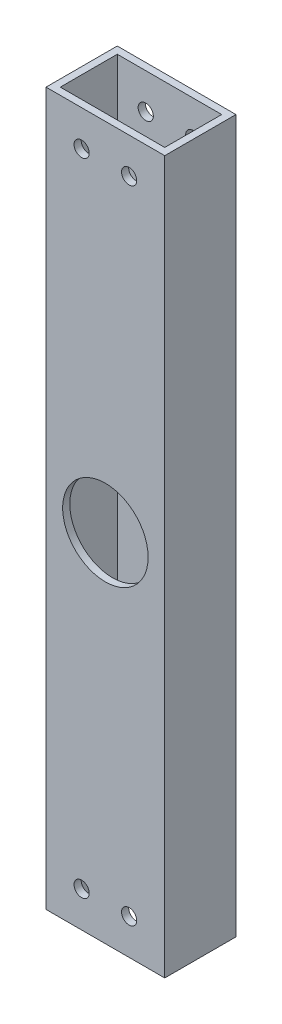
ISO-10303-21;
HEADER;
FILE_DESCRIPTION(('STEP AP214'),'2;1');
FILE_NAME('part.step','',(''),(''),'','','');
FILE_SCHEMA(('AUTOMOTIVE_DESIGN { 1 0 10303 214 1 1 1 1 }'));
ENDSEC;
DATA;
#1=APPLICATION_CONTEXT('core data for automotive mechanical design processes');
#2=APPLICATION_PROTOCOL_DEFINITION('international standard','automotive_design',2000,#1);
#3=PRODUCT_CONTEXT('',#1,'mechanical');
#4=PRODUCT('Part','Part','',(#3));
#5=PRODUCT_RELATED_PRODUCT_CATEGORY('part','',(#4));
#6=PRODUCT_DEFINITION_FORMATION('','',#4);
#7=PRODUCT_DEFINITION_CONTEXT('part definition',#1,'design');
#8=PRODUCT_DEFINITION('design','',#6,#7);
#9=PRODUCT_DEFINITION_SHAPE('','',#8);
#10=(LENGTH_UNIT() NAMED_UNIT(*) SI_UNIT(.MILLI.,.METRE.));
#11=(NAMED_UNIT(*) PLANE_ANGLE_UNIT() SI_UNIT($,.RADIAN.));
#12=(NAMED_UNIT(*) SI_UNIT($,.STERADIAN.) SOLID_ANGLE_UNIT());
#13=UNCERTAINTY_MEASURE_WITH_UNIT(LENGTH_MEASURE(1.E-05),#10,'distance_accuracy_value','');
#14=(GEOMETRIC_REPRESENTATION_CONTEXT(3) GLOBAL_UNCERTAINTY_ASSIGNED_CONTEXT((#13)) GLOBAL_UNIT_ASSIGNED_CONTEXT((#10,
#11,#12)) REPRESENTATION_CONTEXT('',''));
#15=CARTESIAN_POINT('',(0.,0.,0.));
#16=DIRECTION('',(0.,0.,1.));
#17=DIRECTION('',(1.,0.,0.));
#18=AXIS2_PLACEMENT_3D('',#15,#16,#17);
#19=CARTESIAN_POINT('',(0.,150.,0.));
#20=DIRECTION('',(0.,1.,0.));
#21=DIRECTION('',(0.,0.,1.));
#22=AXIS2_PLACEMENT_3D('',#19,#20,#21);
#23=PLANE('',#22);
#24=DIRECTION('',(0.,0.,-1.));
#25=VECTOR('',#24,1.);
#26=CARTESIAN_POINT('',(12.5,150.,-7.5));
#27=LINE('',#26,#25);
#28=CARTESIAN_POINT('',(12.5,150.,7.5));
#29=VERTEX_POINT('',#28);
#30=CARTESIAN_POINT('',(12.5,150.,-7.5));
#31=VERTEX_POINT('',#30);
#32=EDGE_CURVE('E144',#29,#31,#27,.T.);
#33=ORIENTED_EDGE('',*,*,#32,.T.);
#34=DIRECTION('',(-1.,0.,0.));
#35=VECTOR('',#34,1.);
#36=CARTESIAN_POINT('',(-12.5,150.,-7.5));
#37=LINE('',#36,#35);
#38=CARTESIAN_POINT('',(-12.5,150.,-7.5));
#39=VERTEX_POINT('',#38);
#40=EDGE_CURVE('E147',#31,#39,#37,.T.);
#41=ORIENTED_EDGE('',*,*,#40,.T.);
#42=DIRECTION('',(0.,0.,1.));
#43=VECTOR('',#42,1.);
#44=CARTESIAN_POINT('',(-12.5,150.,-7.5));
#45=LINE('',#44,#43);
#46=CARTESIAN_POINT('',(-12.5,150.,7.5));
#47=VERTEX_POINT('',#46);
#48=EDGE_CURVE('E150',#39,#47,#45,.T.);
#49=ORIENTED_EDGE('',*,*,#48,.T.);
#50=DIRECTION('',(1.,0.,0.));
#51=VECTOR('',#50,1.);
#52=CARTESIAN_POINT('',(-12.5,150.,7.5));
#53=LINE('',#52,#51);
#54=EDGE_CURVE('E152',#47,#29,#53,.T.);
#55=ORIENTED_EDGE('',*,*,#54,.T.);
#56=EDGE_LOOP('',(#33,#41,#49,#55));
#57=FACE_BOUND('',#56,.T.);
#58=DIRECTION('',(0.,0.,1.));
#59=VECTOR('',#58,1.);
#60=CARTESIAN_POINT('',(-11.,150.,-6.));
#61=LINE('',#60,#59);
#62=CARTESIAN_POINT('',(-11.,150.,-6.));
#63=VERTEX_POINT('',#62);
#64=CARTESIAN_POINT('',(-11.,150.,6.));
#65=VERTEX_POINT('',#64);
#66=EDGE_CURVE('E114',#63,#65,#61,.T.);
#67=ORIENTED_EDGE('',*,*,#66,.F.);
#68=DIRECTION('',(-1.,0.,0.));
#69=VECTOR('',#68,1.);
#70=CARTESIAN_POINT('',(-11.,150.,-6.));
#71=LINE('',#70,#69);
#72=CARTESIAN_POINT('',(11.,150.,-6.));
#73=VERTEX_POINT('',#72);
#74=EDGE_CURVE('E106',#73,#63,#71,.T.);
#75=ORIENTED_EDGE('',*,*,#74,.F.);
#76=DIRECTION('',(0.,0.,-1.));
#77=VECTOR('',#76,1.);
#78=CARTESIAN_POINT('',(11.,150.,-6.));
#79=LINE('',#78,#77);
#80=CARTESIAN_POINT('',(11.,150.,6.));
#81=VERTEX_POINT('',#80);
#82=EDGE_CURVE('E128',#81,#73,#79,.T.);
#83=ORIENTED_EDGE('',*,*,#82,.F.);
#84=DIRECTION('',(1.,0.,0.));
#85=VECTOR('',#84,1.);
#86=CARTESIAN_POINT('',(-11.,150.,6.));
#87=LINE('',#86,#85);
#88=EDGE_CURVE('E126',#65,#81,#87,.T.);
#89=ORIENTED_EDGE('',*,*,#88,.F.);
#90=EDGE_LOOP('',(#67,#75,#83,#89));
#91=FACE_BOUND('',#90,.T.);
#92=ADVANCED_FACE('F39',(#57,#91),#23,.T.);
#93=CARTESIAN_POINT('',(0.,0.,0.));
#94=DIRECTION('',(0.,1.,0.));
#95=DIRECTION('',(0.,0.,1.));
#96=AXIS2_PLACEMENT_3D('',#93,#94,#95);
#97=PLANE('',#96);
#98=DIRECTION('',(0.,0.,-1.));
#99=VECTOR('',#98,1.);
#100=CARTESIAN_POINT('',(12.5,0.,-7.5));
#101=LINE('',#100,#99);
#102=CARTESIAN_POINT('',(12.5,0.,7.5));
#103=VERTEX_POINT('',#102);
#104=CARTESIAN_POINT('',(12.5,0.,-7.5));
#105=VERTEX_POINT('',#104);
#106=EDGE_CURVE('E122',#103,#105,#101,.T.);
#107=ORIENTED_EDGE('',*,*,#106,.F.);
#108=DIRECTION('',(1.,0.,0.));
#109=VECTOR('',#108,1.);
#110=CARTESIAN_POINT('',(-12.5,0.,7.5));
#111=LINE('',#110,#109);
#112=CARTESIAN_POINT('',(-12.5,0.,7.5));
#113=VERTEX_POINT('',#112);
#114=EDGE_CURVE('E148',#113,#103,#111,.T.);
#115=ORIENTED_EDGE('',*,*,#114,.F.);
#116=DIRECTION('',(0.,0.,1.));
#117=VECTOR('',#116,1.);
#118=CARTESIAN_POINT('',(-12.5,0.,-7.5));
#119=LINE('',#118,#117);
#120=CARTESIAN_POINT('',(-12.5,0.,-7.5));
#121=VERTEX_POINT('',#120);
#122=EDGE_CURVE('E159',#121,#113,#119,.T.);
#123=ORIENTED_EDGE('',*,*,#122,.F.);
#124=DIRECTION('',(-1.,0.,0.));
#125=VECTOR('',#124,1.);
#126=CARTESIAN_POINT('',(-12.5,0.,-7.5));
#127=LINE('',#126,#125);
#128=EDGE_CURVE('E157',#105,#121,#127,.T.);
#129=ORIENTED_EDGE('',*,*,#128,.F.);
#130=EDGE_LOOP('',(#107,#115,#123,#129));
#131=FACE_BOUND('',#130,.T.);
#132=DIRECTION('',(-1.,0.,0.));
#133=VECTOR('',#132,1.);
#134=CARTESIAN_POINT('',(-11.,0.,-6.));
#135=LINE('',#134,#133);
#136=CARTESIAN_POINT('',(11.,0.,-6.));
#137=VERTEX_POINT('',#136);
#138=CARTESIAN_POINT('',(-11.,0.,-6.));
#139=VERTEX_POINT('',#138);
#140=EDGE_CURVE('E64',#137,#139,#135,.T.);
#141=ORIENTED_EDGE('',*,*,#140,.T.);
#142=DIRECTION('',(0.,0.,1.));
#143=VECTOR('',#142,1.);
#144=CARTESIAN_POINT('',(-11.,0.,-6.));
#145=LINE('',#144,#143);
#146=CARTESIAN_POINT('',(-11.,0.,6.));
#147=VERTEX_POINT('',#146);
#148=EDGE_CURVE('E121',#139,#147,#145,.T.);
#149=ORIENTED_EDGE('',*,*,#148,.T.);
#150=DIRECTION('',(1.,0.,0.));
#151=VECTOR('',#150,1.);
#152=CARTESIAN_POINT('',(-11.,0.,6.));
#153=LINE('',#152,#151);
#154=CARTESIAN_POINT('',(11.,0.,6.));
#155=VERTEX_POINT('',#154);
#156=EDGE_CURVE('E136',#147,#155,#153,.T.);
#157=ORIENTED_EDGE('',*,*,#156,.T.);
#158=DIRECTION('',(0.,0.,-1.));
#159=VECTOR('',#158,1.);
#160=CARTESIAN_POINT('',(11.,0.,-6.));
#161=LINE('',#160,#159);
#162=EDGE_CURVE('E115',#155,#137,#161,.T.);
#163=ORIENTED_EDGE('',*,*,#162,.T.);
#164=EDGE_LOOP('',(#141,#149,#157,#163));
#165=FACE_BOUND('',#164,.T.);
#166=ADVANCED_FACE('F217',(#131,#165),#97,.F.);
#167=CARTESIAN_POINT('',(12.5,150.,-7.5));
#168=DIRECTION('',(-1.,0.,0.));
#169=DIRECTION('',(0.,0.,1.));
#170=AXIS2_PLACEMENT_3D('',#167,#168,#169);
#171=PLANE('',#170);
#172=ORIENTED_EDGE('',*,*,#106,.T.);
#173=DIRECTION('',(0.,-1.,0.));
#174=VECTOR('',#173,1.);
#175=CARTESIAN_POINT('',(12.5,150.,-7.5));
#176=LINE('',#175,#174);
#177=EDGE_CURVE('E11',#31,#105,#176,.T.);
#178=ORIENTED_EDGE('',*,*,#177,.F.);
#179=ORIENTED_EDGE('',*,*,#32,.F.);
#180=DIRECTION('',(0.,-1.,0.));
#181=VECTOR('',#180,1.);
#182=CARTESIAN_POINT('',(12.5,150.,7.5));
#183=LINE('',#182,#181);
#184=EDGE_CURVE('E154',#29,#103,#183,.T.);
#185=ORIENTED_EDGE('',*,*,#184,.T.);
#186=EDGE_LOOP('',(#172,#178,#179,#185));
#187=FACE_BOUND('',#186,.T.);
#188=ADVANCED_FACE('F41',(#187),#171,.F.);
#189=CARTESIAN_POINT('',(-12.5,150.,-7.5));
#190=DIRECTION('',(0.,0.,1.));
#191=DIRECTION('',(1.,0.,0.));
#192=AXIS2_PLACEMENT_3D('',#189,#190,#191);
#193=PLANE('',#192);
#194=CARTESIAN_POINT('',(-5.,7.5,-7.5));
#195=DIRECTION('',(0.,0.,1.));
#196=DIRECTION('',(1.,0.,0.));
#197=AXIS2_PLACEMENT_3D('',#194,#195,#196);
#198=CIRCLE('',#197,1.6);
#199=CARTESIAN_POINT('',(-3.4,7.5,-7.5));
#200=VERTEX_POINT('',#199);
#201=EDGE_CURVE('E257',#200,#200,#198,.T.);
#202=ORIENTED_EDGE('',*,*,#201,.T.);
#203=EDGE_LOOP('',(#202));
#204=FACE_BOUND('',#203,.T.);
#205=CARTESIAN_POINT('',(5.00000000000001,142.5,-7.5));
#206=DIRECTION('',(0.,0.,1.));
#207=DIRECTION('',(-1.,0.,0.));
#208=AXIS2_PLACEMENT_3D('',#205,#206,#207);
#209=CIRCLE('',#208,1.6);
#210=CARTESIAN_POINT('',(3.4,142.5,-7.5));
#211=VERTEX_POINT('',#210);
#212=EDGE_CURVE('E261',#211,#211,#209,.T.);
#213=ORIENTED_EDGE('',*,*,#212,.T.);
#214=EDGE_LOOP('',(#213));
#215=FACE_BOUND('',#214,.T.);
#216=CARTESIAN_POINT('',(-5.,142.5,-7.5));
#217=DIRECTION('',(0.,0.,1.));
#218=DIRECTION('',(-1.,0.,0.));
#219=AXIS2_PLACEMENT_3D('',#216,#217,#218);
#220=CIRCLE('',#219,1.6);
#221=CARTESIAN_POINT('',(-6.6,142.5,-7.5));
#222=VERTEX_POINT('',#221);
#223=EDGE_CURVE('E265',#222,#222,#220,.T.);
#224=ORIENTED_EDGE('',*,*,#223,.T.);
#225=EDGE_LOOP('',(#224));
#226=FACE_BOUND('',#225,.T.);
#227=CARTESIAN_POINT('',(0.,75.,-7.5));
#228=DIRECTION('',(0.,0.,1.));
#229=DIRECTION('',(1.,0.,0.));
#230=AXIS2_PLACEMENT_3D('',#227,#228,#229);
#231=CIRCLE('',#230,9.);
#232=CARTESIAN_POINT('',(9.,75.,-7.5));
#233=VERTEX_POINT('',#232);
#234=EDGE_CURVE('E269',#233,#233,#231,.T.);
#235=ORIENTED_EDGE('',*,*,#234,.T.);
#236=EDGE_LOOP('',(#235));
#237=FACE_BOUND('',#236,.T.);
#238=CARTESIAN_POINT('',(5.00000000000001,7.5,-7.5));
#239=DIRECTION('',(0.,0.,1.));
#240=DIRECTION('',(1.,0.,0.));
#241=AXIS2_PLACEMENT_3D('',#238,#239,#240);
#242=CIRCLE('',#241,1.6);
#243=CARTESIAN_POINT('',(6.60000000000001,7.5,-7.5));
#244=VERTEX_POINT('',#243);
#245=EDGE_CURVE('E173',#244,#244,#242,.T.);
#246=ORIENTED_EDGE('',*,*,#245,.T.);
#247=EDGE_LOOP('',(#246));
#248=FACE_BOUND('',#247,.T.);
#249=ORIENTED_EDGE('',*,*,#128,.T.);
#250=DIRECTION('',(0.,-1.,0.));
#251=VECTOR('',#250,1.);
#252=CARTESIAN_POINT('',(-12.5,150.,-7.5));
#253=LINE('',#252,#251);
#254=EDGE_CURVE('E48',#39,#121,#253,.T.);
#255=ORIENTED_EDGE('',*,*,#254,.F.);
#256=ORIENTED_EDGE('',*,*,#40,.F.);
#257=ORIENTED_EDGE('',*,*,#177,.T.);
#258=EDGE_LOOP('',(#249,#255,#256,#257));
#259=FACE_BOUND('',#258,.T.);
#260=ADVANCED_FACE('F247',(#204,#215,#226,#237,#248,#259),#193,.F.);
#261=CARTESIAN_POINT('',(-12.5,150.,-7.5));
#262=DIRECTION('',(1.,0.,0.));
#263=DIRECTION('',(0.,0.,-1.));
#264=AXIS2_PLACEMENT_3D('',#261,#262,#263);
#265=PLANE('',#264);
#266=ORIENTED_EDGE('',*,*,#122,.T.);
#267=DIRECTION('',(0.,-1.,0.));
#268=VECTOR('',#267,1.);
#269=CARTESIAN_POINT('',(-12.5,150.,7.5));
#270=LINE('',#269,#268);
#271=EDGE_CURVE('E164',#47,#113,#270,.T.);
#272=ORIENTED_EDGE('',*,*,#271,.F.);
#273=ORIENTED_EDGE('',*,*,#48,.F.);
#274=ORIENTED_EDGE('',*,*,#254,.T.);
#275=EDGE_LOOP('',(#266,#272,#273,#274));
#276=FACE_BOUND('',#275,.T.);
#277=ADVANCED_FACE('F244',(#276),#265,.F.);
#278=CARTESIAN_POINT('',(-12.5,150.,7.5));
#279=DIRECTION('',(0.,0.,-1.));
#280=DIRECTION('',(-1.,0.,0.));
#281=AXIS2_PLACEMENT_3D('',#278,#279,#280);
#282=PLANE('',#281);
#283=CARTESIAN_POINT('',(-5.,7.5,7.5));
#284=DIRECTION('',(0.,0.,1.));
#285=DIRECTION('',(1.,0.,0.));
#286=AXIS2_PLACEMENT_3D('',#283,#284,#285);
#287=CIRCLE('',#286,1.6);
#288=CARTESIAN_POINT('',(-3.4,7.5,7.5));
#289=VERTEX_POINT('',#288);
#290=EDGE_CURVE('E288',#289,#289,#287,.T.);
#291=ORIENTED_EDGE('',*,*,#290,.F.);
#292=EDGE_LOOP('',(#291));
#293=FACE_BOUND('',#292,.T.);
#294=CARTESIAN_POINT('',(5.00000000000001,142.5,7.5));
#295=DIRECTION('',(0.,0.,1.));
#296=DIRECTION('',(-1.,0.,0.));
#297=AXIS2_PLACEMENT_3D('',#294,#295,#296);
#298=CIRCLE('',#297,1.6);
#299=CARTESIAN_POINT('',(3.4,142.5,7.5));
#300=VERTEX_POINT('',#299);
#301=EDGE_CURVE('E320',#300,#300,#298,.T.);
#302=ORIENTED_EDGE('',*,*,#301,.F.);
#303=EDGE_LOOP('',(#302));
#304=FACE_BOUND('',#303,.T.);
#305=CARTESIAN_POINT('',(-5.,142.5,7.5));
#306=DIRECTION('',(0.,0.,1.));
#307=DIRECTION('',(-1.,0.,0.));
#308=AXIS2_PLACEMENT_3D('',#305,#306,#307);
#309=CIRCLE('',#308,1.6);
#310=CARTESIAN_POINT('',(-6.6,142.5,7.5));
#311=VERTEX_POINT('',#310);
#312=EDGE_CURVE('E324',#311,#311,#309,.T.);
#313=ORIENTED_EDGE('',*,*,#312,.F.);
#314=EDGE_LOOP('',(#313));
#315=FACE_BOUND('',#314,.T.);
#316=CARTESIAN_POINT('',(0.,75.,7.5));
#317=DIRECTION('',(0.,0.,1.));
#318=DIRECTION('',(1.,0.,0.));
#319=AXIS2_PLACEMENT_3D('',#316,#317,#318);
#320=CIRCLE('',#319,9.);
#321=CARTESIAN_POINT('',(9.,75.,7.5));
#322=VERTEX_POINT('',#321);
#323=EDGE_CURVE('E312',#322,#322,#320,.T.);
#324=ORIENTED_EDGE('',*,*,#323,.F.);
#325=EDGE_LOOP('',(#324));
#326=FACE_BOUND('',#325,.T.);
#327=CARTESIAN_POINT('',(5.00000000000001,7.5,7.5));
#328=DIRECTION('',(0.,0.,1.));
#329=DIRECTION('',(1.,0.,0.));
#330=AXIS2_PLACEMENT_3D('',#327,#328,#329);
#331=CIRCLE('',#330,1.6);
#332=CARTESIAN_POINT('',(6.60000000000001,7.5,7.5));
#333=VERTEX_POINT('',#332);
#334=EDGE_CURVE('E285',#333,#333,#331,.T.);
#335=ORIENTED_EDGE('',*,*,#334,.F.);
#336=EDGE_LOOP('',(#335));
#337=FACE_BOUND('',#336,.T.);
#338=ORIENTED_EDGE('',*,*,#114,.T.);
#339=ORIENTED_EDGE('',*,*,#184,.F.);
#340=ORIENTED_EDGE('',*,*,#54,.F.);
#341=ORIENTED_EDGE('',*,*,#271,.T.);
#342=EDGE_LOOP('',(#338,#339,#340,#341));
#343=FACE_BOUND('',#342,.T.);
#344=ADVANCED_FACE('F241',(#293,#304,#315,#326,#337,#343),#282,.F.);
#345=CARTESIAN_POINT('',(-11.,150.,-6.));
#346=DIRECTION('',(0.,0.,1.));
#347=DIRECTION('',(1.,0.,0.));
#348=AXIS2_PLACEMENT_3D('',#345,#346,#347);
#349=PLANE('',#348);
#350=CARTESIAN_POINT('',(-5.,7.5,-6.));
#351=DIRECTION('',(0.,0.,1.));
#352=DIRECTION('',(1.,0.,0.));
#353=AXIS2_PLACEMENT_3D('',#350,#351,#352);
#354=CIRCLE('',#353,1.6);
#355=CARTESIAN_POINT('',(-3.4,7.5,-6.));
#356=VERTEX_POINT('',#355);
#357=EDGE_CURVE('E134',#356,#356,#354,.T.);
#358=ORIENTED_EDGE('',*,*,#357,.F.);
#359=EDGE_LOOP('',(#358));
#360=FACE_BOUND('',#359,.T.);
#361=CARTESIAN_POINT('',(5.00000000000001,142.5,-6.));
#362=DIRECTION('',(0.,0.,1.));
#363=DIRECTION('',(1.,0.,0.));
#364=AXIS2_PLACEMENT_3D('',#361,#362,#363);
#365=CIRCLE('',#364,1.6);
#366=CARTESIAN_POINT('',(6.60000000000001,142.5,-6.));
#367=VERTEX_POINT('',#366);
#368=EDGE_CURVE('E183',#367,#367,#365,.T.);
#369=ORIENTED_EDGE('',*,*,#368,.F.);
#370=EDGE_LOOP('',(#369));
#371=FACE_BOUND('',#370,.T.);
#372=CARTESIAN_POINT('',(-5.,142.5,-6.));
#373=DIRECTION('',(0.,0.,1.));
#374=DIRECTION('',(1.,0.,0.));
#375=AXIS2_PLACEMENT_3D('',#372,#373,#374);
#376=CIRCLE('',#375,1.6);
#377=CARTESIAN_POINT('',(-3.4,142.5,-6.));
#378=VERTEX_POINT('',#377);
#379=EDGE_CURVE('E180',#378,#378,#376,.T.);
#380=ORIENTED_EDGE('',*,*,#379,.F.);
#381=EDGE_LOOP('',(#380));
#382=FACE_BOUND('',#381,.T.);
#383=CARTESIAN_POINT('',(0.,75.,-6.));
#384=DIRECTION('',(0.,0.,1.));
#385=DIRECTION('',(1.,0.,0.));
#386=AXIS2_PLACEMENT_3D('',#383,#384,#385);
#387=CIRCLE('',#386,9.);
#388=CARTESIAN_POINT('',(9.,75.,-6.));
#389=VERTEX_POINT('',#388);
#390=EDGE_CURVE('E177',#389,#389,#387,.T.);
#391=ORIENTED_EDGE('',*,*,#390,.F.);
#392=EDGE_LOOP('',(#391));
#393=FACE_BOUND('',#392,.T.);
#394=CARTESIAN_POINT('',(5.00000000000001,7.5,-6.));
#395=DIRECTION('',(0.,0.,1.));
#396=DIRECTION('',(1.,0.,0.));
#397=AXIS2_PLACEMENT_3D('',#394,#395,#396);
#398=CIRCLE('',#397,1.6);
#399=CARTESIAN_POINT('',(6.60000000000001,7.5,-6.));
#400=VERTEX_POINT('',#399);
#401=EDGE_CURVE('E172',#400,#400,#398,.T.);
#402=ORIENTED_EDGE('',*,*,#401,.F.);
#403=EDGE_LOOP('',(#402));
#404=FACE_BOUND('',#403,.T.);
#405=ORIENTED_EDGE('',*,*,#140,.F.);
#406=DIRECTION('',(0.,-1.,0.));
#407=VECTOR('',#406,1.);
#408=CARTESIAN_POINT('',(11.,150.,-6.));
#409=LINE('',#408,#407);
#410=EDGE_CURVE('E110',#73,#137,#409,.T.);
#411=ORIENTED_EDGE('',*,*,#410,.F.);
#412=ORIENTED_EDGE('',*,*,#74,.T.);
#413=DIRECTION('',(0.,-1.,0.));
#414=VECTOR('',#413,1.);
#415=CARTESIAN_POINT('',(-11.,150.,-6.));
#416=LINE('',#415,#414);
#417=EDGE_CURVE('E109',#63,#139,#416,.T.);
#418=ORIENTED_EDGE('',*,*,#417,.T.);
#419=EDGE_LOOP('',(#405,#411,#412,#418));
#420=FACE_BOUND('',#419,.T.);
#421=ADVANCED_FACE('F108',(#360,#371,#382,#393,#404,#420),#349,.T.);
#422=CARTESIAN_POINT('',(-11.,150.,-6.));
#423=DIRECTION('',(1.,0.,0.));
#424=DIRECTION('',(0.,0.,-1.));
#425=AXIS2_PLACEMENT_3D('',#422,#423,#424);
#426=PLANE('',#425);
#427=ORIENTED_EDGE('',*,*,#148,.F.);
#428=ORIENTED_EDGE('',*,*,#417,.F.);
#429=ORIENTED_EDGE('',*,*,#66,.T.);
#430=DIRECTION('',(0.,-1.,0.));
#431=VECTOR('',#430,1.);
#432=CARTESIAN_POINT('',(-11.,150.,6.));
#433=LINE('',#432,#431);
#434=EDGE_CURVE('E123',#65,#147,#433,.T.);
#435=ORIENTED_EDGE('',*,*,#434,.T.);
#436=EDGE_LOOP('',(#427,#428,#429,#435));
#437=FACE_BOUND('',#436,.T.);
#438=ADVANCED_FACE('F118',(#437),#426,.T.);
#439=CARTESIAN_POINT('',(-11.,150.,6.));
#440=DIRECTION('',(0.,0.,-1.));
#441=DIRECTION('',(-1.,0.,0.));
#442=AXIS2_PLACEMENT_3D('',#439,#440,#441);
#443=PLANE('',#442);
#444=CARTESIAN_POINT('',(-5.,7.5,6.));
#445=DIRECTION('',(0.,0.,-1.));
#446=DIRECTION('',(-1.,0.,0.));
#447=AXIS2_PLACEMENT_3D('',#444,#445,#446);
#448=CIRCLE('',#447,1.6);
#449=CARTESIAN_POINT('',(-6.6,7.5,6.));
#450=VERTEX_POINT('',#449);
#451=EDGE_CURVE('E43',#450,#450,#448,.T.);
#452=ORIENTED_EDGE('',*,*,#451,.F.);
#453=EDGE_LOOP('',(#452));
#454=FACE_BOUND('',#453,.T.);
#455=CARTESIAN_POINT('',(5.00000000000001,142.5,6.));
#456=DIRECTION('',(0.,0.,-1.));
#457=DIRECTION('',(-1.,0.,0.));
#458=AXIS2_PLACEMENT_3D('',#455,#456,#457);
#459=CIRCLE('',#458,1.6);
#460=CARTESIAN_POINT('',(3.4,142.5,6.));
#461=VERTEX_POINT('',#460);
#462=EDGE_CURVE('E181',#461,#461,#459,.T.);
#463=ORIENTED_EDGE('',*,*,#462,.F.);
#464=EDGE_LOOP('',(#463));
#465=FACE_BOUND('',#464,.T.);
#466=CARTESIAN_POINT('',(-5.,142.5,6.));
#467=DIRECTION('',(0.,0.,-1.));
#468=DIRECTION('',(-1.,0.,0.));
#469=AXIS2_PLACEMENT_3D('',#466,#467,#468);
#470=CIRCLE('',#469,1.6);
#471=CARTESIAN_POINT('',(-6.6,142.5,6.));
#472=VERTEX_POINT('',#471);
#473=EDGE_CURVE('E178',#472,#472,#470,.T.);
#474=ORIENTED_EDGE('',*,*,#473,.F.);
#475=EDGE_LOOP('',(#474));
#476=FACE_BOUND('',#475,.T.);
#477=CARTESIAN_POINT('',(0.,75.,6.));
#478=DIRECTION('',(0.,0.,-1.));
#479=DIRECTION('',(-1.,0.,0.));
#480=AXIS2_PLACEMENT_3D('',#477,#478,#479);
#481=CIRCLE('',#480,9.);
#482=CARTESIAN_POINT('',(-9.,75.,6.));
#483=VERTEX_POINT('',#482);
#484=EDGE_CURVE('E174',#483,#483,#481,.T.);
#485=ORIENTED_EDGE('',*,*,#484,.F.);
#486=EDGE_LOOP('',(#485));
#487=FACE_BOUND('',#486,.T.);
#488=CARTESIAN_POINT('',(5.00000000000001,7.5,6.));
#489=DIRECTION('',(0.,0.,-1.));
#490=DIRECTION('',(-1.,0.,0.));
#491=AXIS2_PLACEMENT_3D('',#488,#489,#490);
#492=CIRCLE('',#491,1.6);
#493=CARTESIAN_POINT('',(3.4,7.5,6.));
#494=VERTEX_POINT('',#493);
#495=EDGE_CURVE('E169',#494,#494,#492,.T.);
#496=ORIENTED_EDGE('',*,*,#495,.F.);
#497=EDGE_LOOP('',(#496));
#498=FACE_BOUND('',#497,.T.);
#499=ORIENTED_EDGE('',*,*,#156,.F.);
#500=ORIENTED_EDGE('',*,*,#434,.F.);
#501=ORIENTED_EDGE('',*,*,#88,.T.);
#502=DIRECTION('',(0.,-1.,0.));
#503=VECTOR('',#502,1.);
#504=CARTESIAN_POINT('',(11.,150.,6.));
#505=LINE('',#504,#503);
#506=EDGE_CURVE('E56',#81,#155,#505,.T.);
#507=ORIENTED_EDGE('',*,*,#506,.T.);
#508=EDGE_LOOP('',(#499,#500,#501,#507));
#509=FACE_BOUND('',#508,.T.);
#510=ADVANCED_FACE('F203',(#454,#465,#476,#487,#498,#509),#443,.T.);
#511=CARTESIAN_POINT('',(11.,150.,-6.));
#512=DIRECTION('',(-1.,0.,0.));
#513=DIRECTION('',(0.,0.,1.));
#514=AXIS2_PLACEMENT_3D('',#511,#512,#513);
#515=PLANE('',#514);
#516=ORIENTED_EDGE('',*,*,#162,.F.);
#517=ORIENTED_EDGE('',*,*,#506,.F.);
#518=ORIENTED_EDGE('',*,*,#82,.T.);
#519=ORIENTED_EDGE('',*,*,#410,.T.);
#520=EDGE_LOOP('',(#516,#517,#518,#519));
#521=FACE_BOUND('',#520,.T.);
#522=ADVANCED_FACE('F206',(#521),#515,.T.);
#523=CARTESIAN_POINT('',(5.00000000000001,7.5,-7.5));
#524=DIRECTION('',(0.,0.,1.));
#525=DIRECTION('',(1.,0.,0.));
#526=AXIS2_PLACEMENT_3D('',#523,#524,#525);
#527=CYLINDRICAL_SURFACE('',#526,1.6);
#528=ORIENTED_EDGE('',*,*,#495,.T.);
#529=EDGE_LOOP('',(#528));
#530=FACE_BOUND('',#529,.T.);
#531=ORIENTED_EDGE('',*,*,#334,.T.);
#532=EDGE_LOOP('',(#531));
#533=FACE_BOUND('',#532,.T.);
#534=ADVANCED_FACE('F219',(#530,#533),#527,.F.);
#535=CARTESIAN_POINT('',(0.,75.,-7.5));
#536=DIRECTION('',(0.,0.,1.));
#537=DIRECTION('',(1.,0.,0.));
#538=AXIS2_PLACEMENT_3D('',#535,#536,#537);
#539=CYLINDRICAL_SURFACE('',#538,9.);
#540=ORIENTED_EDGE('',*,*,#484,.T.);
#541=EDGE_LOOP('',(#540));
#542=FACE_BOUND('',#541,.T.);
#543=ORIENTED_EDGE('',*,*,#323,.T.);
#544=EDGE_LOOP('',(#543));
#545=FACE_BOUND('',#544,.T.);
#546=ADVANCED_FACE('F226',(#542,#545),#539,.F.);
#547=CARTESIAN_POINT('',(-5.,142.5,-7.5));
#548=DIRECTION('',(0.,0.,1.));
#549=DIRECTION('',(1.,0.,0.));
#550=AXIS2_PLACEMENT_3D('',#547,#548,#549);
#551=CYLINDRICAL_SURFACE('',#550,1.6);
#552=ORIENTED_EDGE('',*,*,#473,.T.);
#553=EDGE_LOOP('',(#552));
#554=FACE_BOUND('',#553,.T.);
#555=ORIENTED_EDGE('',*,*,#312,.T.);
#556=EDGE_LOOP('',(#555));
#557=FACE_BOUND('',#556,.T.);
#558=ADVANCED_FACE('F329',(#554,#557),#551,.F.);
#559=CARTESIAN_POINT('',(5.00000000000001,142.5,-7.5));
#560=DIRECTION('',(0.,0.,1.));
#561=DIRECTION('',(1.,0.,0.));
#562=AXIS2_PLACEMENT_3D('',#559,#560,#561);
#563=CYLINDRICAL_SURFACE('',#562,1.6);
#564=ORIENTED_EDGE('',*,*,#462,.T.);
#565=EDGE_LOOP('',(#564));
#566=FACE_BOUND('',#565,.T.);
#567=ORIENTED_EDGE('',*,*,#301,.T.);
#568=EDGE_LOOP('',(#567));
#569=FACE_BOUND('',#568,.T.);
#570=ADVANCED_FACE('F342',(#566,#569),#563,.F.);
#571=CARTESIAN_POINT('',(-5.,7.5,-7.5));
#572=DIRECTION('',(0.,0.,1.));
#573=DIRECTION('',(1.,0.,0.));
#574=AXIS2_PLACEMENT_3D('',#571,#572,#573);
#575=CYLINDRICAL_SURFACE('',#574,1.6);
#576=ORIENTED_EDGE('',*,*,#451,.T.);
#577=EDGE_LOOP('',(#576));
#578=FACE_BOUND('',#577,.T.);
#579=ORIENTED_EDGE('',*,*,#290,.T.);
#580=EDGE_LOOP('',(#579));
#581=FACE_BOUND('',#580,.T.);
#582=ADVANCED_FACE('F200',(#578,#581),#575,.F.);
#583=ORIENTED_EDGE('',*,*,#401,.T.);
#584=EDGE_LOOP('',(#583));
#585=FACE_BOUND('',#584,.T.);
#586=ORIENTED_EDGE('',*,*,#245,.F.);
#587=EDGE_LOOP('',(#586));
#588=FACE_BOUND('',#587,.T.);
#589=ADVANCED_FACE('F229',(#585,#588),#527,.F.);
#590=ORIENTED_EDGE('',*,*,#390,.T.);
#591=EDGE_LOOP('',(#590));
#592=FACE_BOUND('',#591,.T.);
#593=ORIENTED_EDGE('',*,*,#234,.F.);
#594=EDGE_LOOP('',(#593));
#595=FACE_BOUND('',#594,.T.);
#596=ADVANCED_FACE('F307',(#592,#595),#539,.F.);
#597=ORIENTED_EDGE('',*,*,#379,.T.);
#598=EDGE_LOOP('',(#597));
#599=FACE_BOUND('',#598,.T.);
#600=ORIENTED_EDGE('',*,*,#223,.F.);
#601=EDGE_LOOP('',(#600));
#602=FACE_BOUND('',#601,.T.);
#603=ADVANCED_FACE('F310',(#599,#602),#551,.F.);
#604=ORIENTED_EDGE('',*,*,#368,.T.);
#605=EDGE_LOOP('',(#604));
#606=FACE_BOUND('',#605,.T.);
#607=ORIENTED_EDGE('',*,*,#212,.F.);
#608=EDGE_LOOP('',(#607));
#609=FACE_BOUND('',#608,.T.);
#610=ADVANCED_FACE('F350',(#606,#609),#563,.F.);
#611=ORIENTED_EDGE('',*,*,#357,.T.);
#612=EDGE_LOOP('',(#611));
#613=FACE_BOUND('',#612,.T.);
#614=ORIENTED_EDGE('',*,*,#201,.F.);
#615=EDGE_LOOP('',(#614));
#616=FACE_BOUND('',#615,.T.);
#617=ADVANCED_FACE('F348',(#613,#616),#575,.F.);
#618=CLOSED_SHELL('',(#92,#166,#188,#260,#277,#344,#421,#438,#510,#522,#534,#546,#558,#570,#582,
#589,#596,#603,#610,#617));
#619=MANIFOLD_SOLID_BREP('B2',#618);
#620=ADVANCED_BREP_SHAPE_REPRESENTATION('',(#18,#619),#14);
#621=SHAPE_DEFINITION_REPRESENTATION(#9,#620);
ENDSEC;
END-ISO-10303-21;
